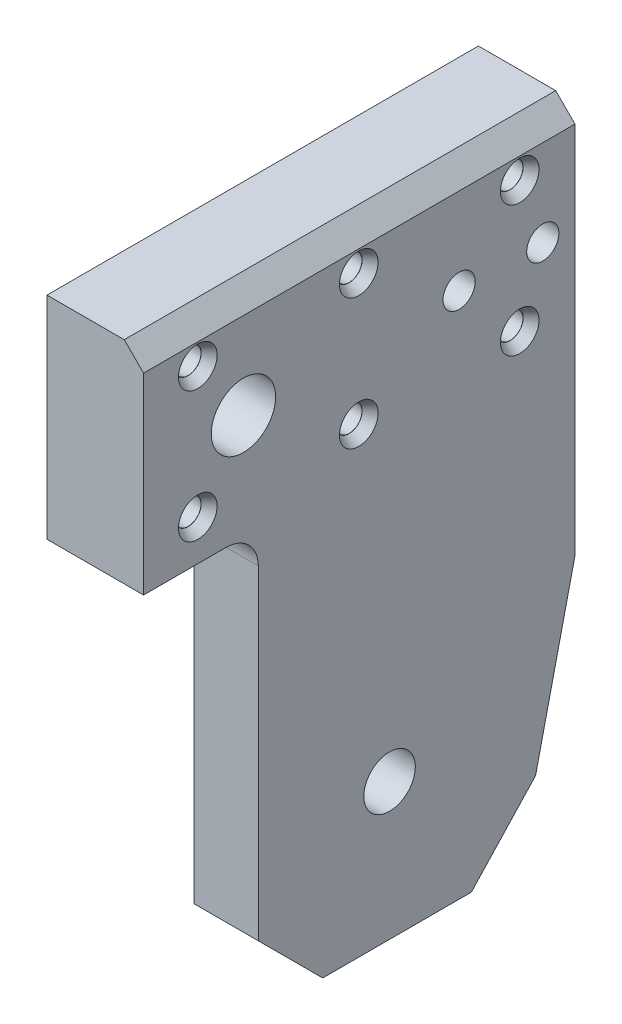
ISO-10303-21;
HEADER;
FILE_DESCRIPTION(('STEP AP214'),'2;1');
FILE_NAME('part.step','',(''),(''),'','','');
FILE_SCHEMA(('AUTOMOTIVE_DESIGN { 1 0 10303 214 1 1 1 1 }'));
ENDSEC;
DATA;
#1=APPLICATION_CONTEXT('core data for automotive mechanical design processes');
#2=APPLICATION_PROTOCOL_DEFINITION('international standard','automotive_design',2000,#1);
#3=PRODUCT_CONTEXT('',#1,'mechanical');
#4=PRODUCT('Part','Part','',(#3));
#5=PRODUCT_RELATED_PRODUCT_CATEGORY('part','',(#4));
#6=PRODUCT_DEFINITION_FORMATION('','',#4);
#7=PRODUCT_DEFINITION_CONTEXT('part definition',#1,'design');
#8=PRODUCT_DEFINITION('design','',#6,#7);
#9=PRODUCT_DEFINITION_SHAPE('','',#8);
#10=(LENGTH_UNIT() NAMED_UNIT(*) SI_UNIT(.MILLI.,.METRE.));
#11=(NAMED_UNIT(*) PLANE_ANGLE_UNIT() SI_UNIT($,.RADIAN.));
#12=(NAMED_UNIT(*) SI_UNIT($,.STERADIAN.) SOLID_ANGLE_UNIT());
#13=UNCERTAINTY_MEASURE_WITH_UNIT(LENGTH_MEASURE(1.E-05),#10,'distance_accuracy_value','');
#14=(GEOMETRIC_REPRESENTATION_CONTEXT(3) GLOBAL_UNCERTAINTY_ASSIGNED_CONTEXT((#13)) GLOBAL_UNIT_ASSIGNED_CONTEXT((#10,
#11,#12)) REPRESENTATION_CONTEXT('',''));
#15=CARTESIAN_POINT('',(0.,0.,0.));
#16=DIRECTION('',(0.,0.,1.));
#17=DIRECTION('',(1.,0.,0.));
#18=AXIS2_PLACEMENT_3D('',#15,#16,#17);
#19=CARTESIAN_POINT('',(0.,-26.5698238033902,-33.8358883973132));
#20=DIRECTION('',(1.,0.,0.));
#21=DIRECTION('',(0.,0.,-1.));
#22=AXIS2_PLACEMENT_3D('',#19,#20,#21);
#23=CYLINDRICAL_SURFACE('',#22,2.);
#24=CARTESIAN_POINT('',(0.,-26.5698238033902,-33.8358883973132));
#25=DIRECTION('',(1.,0.,0.));
#26=DIRECTION('',(0.,0.,-1.));
#27=AXIS2_PLACEMENT_3D('',#24,#25,#26);
#28=CIRCLE('',#27,2.);
#29=CARTESIAN_POINT('',(0.,-26.5698238033902,-35.8358883973132));
#30=VERTEX_POINT('',#29);
#31=EDGE_CURVE('E207',#30,#30,#28,.T.);
#32=ORIENTED_EDGE('',*,*,#31,.F.);
#33=EDGE_LOOP('',(#32));
#34=FACE_BOUND('',#33,.T.);
#35=CARTESIAN_POINT('',(13.5,-26.5698238033902,-33.8358883973132));
#36=DIRECTION('',(1.,0.,0.));
#37=DIRECTION('',(0.,0.,-1.));
#38=AXIS2_PLACEMENT_3D('',#35,#36,#37);
#39=CIRCLE('',#38,2.);
#40=CARTESIAN_POINT('',(13.5,-26.5698238033902,-35.8358883973132));
#41=VERTEX_POINT('',#40);
#42=EDGE_CURVE('E229',#41,#41,#39,.F.);
#43=ORIENTED_EDGE('',*,*,#42,.F.);
#44=EDGE_LOOP('',(#43));
#45=FACE_BOUND('',#44,.T.);
#46=ADVANCED_FACE('F31',(#34,#45),#23,.F.);
#47=CARTESIAN_POINT('',(0.,-26.5698238129198,-8.83588839731317));
#48=DIRECTION('',(1.,0.,0.));
#49=DIRECTION('',(0.,0.,-1.));
#50=AXIS2_PLACEMENT_3D('',#47,#48,#49);
#51=CYLINDRICAL_SURFACE('',#50,2.);
#52=CARTESIAN_POINT('',(0.,-26.5698238129198,-8.83588839731317));
#53=DIRECTION('',(1.,0.,0.));
#54=DIRECTION('',(0.,0.,-1.));
#55=AXIS2_PLACEMENT_3D('',#52,#53,#54);
#56=CIRCLE('',#55,2.);
#57=CARTESIAN_POINT('',(0.,-26.5698238129198,-10.8358883973132));
#58=VERTEX_POINT('',#57);
#59=EDGE_CURVE('E461',#58,#58,#56,.T.);
#60=ORIENTED_EDGE('',*,*,#59,.F.);
#61=EDGE_LOOP('',(#60));
#62=FACE_BOUND('',#61,.T.);
#63=CARTESIAN_POINT('',(13.5,-26.5698238129198,-8.83588839731317));
#64=DIRECTION('',(1.,0.,0.));
#65=DIRECTION('',(0.,0.,-1.));
#66=AXIS2_PLACEMENT_3D('',#63,#64,#65);
#67=CIRCLE('',#66,2.);
#68=CARTESIAN_POINT('',(13.5,-26.5698238129198,-10.8358883973132));
#69=VERTEX_POINT('',#68);
#70=EDGE_CURVE('E224',#69,#69,#67,.F.);
#71=ORIENTED_EDGE('',*,*,#70,.F.);
#72=EDGE_LOOP('',(#71));
#73=FACE_BOUND('',#72,.T.);
#74=ADVANCED_FACE('F306',(#62,#73),#51,.F.);
#75=CARTESIAN_POINT('',(0.,-26.5698238224494,16.1641116026868));
#76=DIRECTION('',(1.,0.,0.));
#77=DIRECTION('',(0.,0.,-1.));
#78=AXIS2_PLACEMENT_3D('',#75,#76,#77);
#79=CYLINDRICAL_SURFACE('',#78,2.);
#80=CARTESIAN_POINT('',(0.,-26.5698238224494,16.1641116026868));
#81=DIRECTION('',(1.,0.,0.));
#82=DIRECTION('',(0.,0.,-1.));
#83=AXIS2_PLACEMENT_3D('',#80,#81,#82);
#84=CIRCLE('',#83,2.);
#85=CARTESIAN_POINT('',(0.,-26.5698238224494,14.1641116026868));
#86=VERTEX_POINT('',#85);
#87=EDGE_CURVE('E464',#86,#86,#84,.T.);
#88=ORIENTED_EDGE('',*,*,#87,.F.);
#89=EDGE_LOOP('',(#88));
#90=FACE_BOUND('',#89,.T.);
#91=CARTESIAN_POINT('',(13.5,-26.5698238224494,16.1641116026868));
#92=DIRECTION('',(1.,0.,0.));
#93=DIRECTION('',(0.,0.,-1.));
#94=AXIS2_PLACEMENT_3D('',#91,#92,#93);
#95=CIRCLE('',#94,2.);
#96=CARTESIAN_POINT('',(13.5,-26.5698238224494,14.1641116026868));
#97=VERTEX_POINT('',#96);
#98=EDGE_CURVE('E219',#97,#97,#95,.F.);
#99=ORIENTED_EDGE('',*,*,#98,.F.);
#100=EDGE_LOOP('',(#99));
#101=FACE_BOUND('',#100,.T.);
#102=ADVANCED_FACE('F312',(#90,#101),#79,.F.);
#103=CARTESIAN_POINT('',(0.,-6.27649809513879,-33.8358883895777));
#104=DIRECTION('',(1.,0.,0.));
#105=DIRECTION('',(0.,0.,-1.));
#106=AXIS2_PLACEMENT_3D('',#103,#104,#105);
#107=CYLINDRICAL_SURFACE('',#106,2.);
#108=CARTESIAN_POINT('',(0.,-6.27649809513879,-33.8358883895777));
#109=DIRECTION('',(1.,0.,0.));
#110=DIRECTION('',(0.,0.,-1.));
#111=AXIS2_PLACEMENT_3D('',#108,#109,#110);
#112=CIRCLE('',#111,2.);
#113=CARTESIAN_POINT('',(0.,-6.27649809513879,-35.8358883895777));
#114=VERTEX_POINT('',#113);
#115=EDGE_CURVE('E467',#114,#114,#112,.T.);
#116=ORIENTED_EDGE('',*,*,#115,.F.);
#117=EDGE_LOOP('',(#116));
#118=FACE_BOUND('',#117,.T.);
#119=CARTESIAN_POINT('',(13.5,-6.27649809513879,-33.8358883895777));
#120=DIRECTION('',(1.,0.,0.));
#121=DIRECTION('',(0.,0.,-1.));
#122=AXIS2_PLACEMENT_3D('',#119,#120,#121);
#123=CIRCLE('',#122,2.);
#124=CARTESIAN_POINT('',(13.5,-6.27649809513879,-35.8358883895777));
#125=VERTEX_POINT('',#124);
#126=EDGE_CURVE('E214',#125,#125,#123,.F.);
#127=ORIENTED_EDGE('',*,*,#126,.F.);
#128=EDGE_LOOP('',(#127));
#129=FACE_BOUND('',#128,.T.);
#130=ADVANCED_FACE('F323',(#118,#129),#107,.F.);
#131=CARTESIAN_POINT('',(0.,-6.27649810466838,-8.83588838957769));
#132=DIRECTION('',(1.,0.,0.));
#133=DIRECTION('',(0.,0.,-1.));
#134=AXIS2_PLACEMENT_3D('',#131,#132,#133);
#135=CYLINDRICAL_SURFACE('',#134,2.);
#136=CARTESIAN_POINT('',(0.,-6.27649810466838,-8.83588838957769));
#137=DIRECTION('',(1.,0.,0.));
#138=DIRECTION('',(0.,0.,-1.));
#139=AXIS2_PLACEMENT_3D('',#136,#137,#138);
#140=CIRCLE('',#139,2.);
#141=CARTESIAN_POINT('',(0.,-6.27649810466838,-10.8358883895777));
#142=VERTEX_POINT('',#141);
#143=EDGE_CURVE('E470',#142,#142,#140,.T.);
#144=ORIENTED_EDGE('',*,*,#143,.F.);
#145=EDGE_LOOP('',(#144));
#146=FACE_BOUND('',#145,.T.);
#147=CARTESIAN_POINT('',(13.5,-6.27649810466838,-8.83588838957769));
#148=DIRECTION('',(1.,0.,0.));
#149=DIRECTION('',(0.,0.,-1.));
#150=AXIS2_PLACEMENT_3D('',#147,#148,#149);
#151=CIRCLE('',#150,2.);
#152=CARTESIAN_POINT('',(13.5,-6.27649810466838,-10.8358883895777));
#153=VERTEX_POINT('',#152);
#154=EDGE_CURVE('E209',#153,#153,#151,.F.);
#155=ORIENTED_EDGE('',*,*,#154,.F.);
#156=EDGE_LOOP('',(#155));
#157=FACE_BOUND('',#156,.T.);
#158=ADVANCED_FACE('F327',(#146,#157),#135,.F.);
#159=CARTESIAN_POINT('',(0.,-6.27649811419797,16.1641116104223));
#160=DIRECTION('',(1.,0.,0.));
#161=DIRECTION('',(0.,0.,-1.));
#162=AXIS2_PLACEMENT_3D('',#159,#160,#161);
#163=CYLINDRICAL_SURFACE('',#162,2.);
#164=CARTESIAN_POINT('',(0.,-6.27649811419797,16.1641116104223));
#165=DIRECTION('',(1.,0.,0.));
#166=DIRECTION('',(0.,0.,-1.));
#167=AXIS2_PLACEMENT_3D('',#164,#165,#166);
#168=CIRCLE('',#167,2.);
#169=CARTESIAN_POINT('',(0.,-6.27649811419797,14.1641116104223));
#170=VERTEX_POINT('',#169);
#171=EDGE_CURVE('E473',#170,#170,#168,.T.);
#172=ORIENTED_EDGE('',*,*,#171,.F.);
#173=EDGE_LOOP('',(#172));
#174=FACE_BOUND('',#173,.T.);
#175=CARTESIAN_POINT('',(13.5,-6.27649811419797,16.1641116104223));
#176=DIRECTION('',(1.,0.,0.));
#177=DIRECTION('',(0.,0.,-1.));
#178=AXIS2_PLACEMENT_3D('',#175,#176,#177);
#179=CIRCLE('',#178,2.);
#180=CARTESIAN_POINT('',(13.5,-6.27649811419797,14.1641116104223));
#181=VERTEX_POINT('',#180);
#182=EDGE_CURVE('E204',#181,#181,#179,.F.);
#183=ORIENTED_EDGE('',*,*,#182,.F.);
#184=EDGE_LOOP('',(#183));
#185=FACE_BOUND('',#184,.T.);
#186=ADVANCED_FACE('F331',(#174,#185),#163,.F.);
#187=CARTESIAN_POINT('',(15.,-0.00061706357254096,-42.4174534241833));
#188=DIRECTION('',(-1.,0.,0.));
#189=DIRECTION('',(0.,0.,1.));
#190=AXIS2_PLACEMENT_3D('',#187,#188,#189);
#191=PLANE('',#190);
#192=CARTESIAN_POINT('',(15.,-26.5698238033902,-33.8358883973132));
#193=DIRECTION('',(1.,0.,0.));
#194=DIRECTION('',(0.,0.,-1.));
#195=AXIS2_PLACEMENT_3D('',#192,#193,#194);
#196=CIRCLE('',#195,3.);
#197=CARTESIAN_POINT('',(15.,-26.5698238033902,-36.8358883973132));
#198=VERTEX_POINT('',#197);
#199=EDGE_CURVE('E435',#198,#198,#196,.T.);
#200=ORIENTED_EDGE('',*,*,#199,.F.);
#201=EDGE_LOOP('',(#200));
#202=FACE_BOUND('',#201,.T.);
#203=CARTESIAN_POINT('',(15.,-26.5698238129198,-8.83588839731317));
#204=DIRECTION('',(1.,0.,0.));
#205=DIRECTION('',(0.,0.,-1.));
#206=AXIS2_PLACEMENT_3D('',#203,#204,#205);
#207=CIRCLE('',#206,3.);
#208=CARTESIAN_POINT('',(15.,-26.5698238129198,-11.8358883973132));
#209=VERTEX_POINT('',#208);
#210=EDGE_CURVE('E232',#209,#209,#207,.T.);
#211=ORIENTED_EDGE('',*,*,#210,.F.);
#212=EDGE_LOOP('',(#211));
#213=FACE_BOUND('',#212,.T.);
#214=CARTESIAN_POINT('',(15.,-26.5698238224494,16.1641116026868));
#215=DIRECTION('',(1.,0.,0.));
#216=DIRECTION('',(0.,0.,-1.));
#217=AXIS2_PLACEMENT_3D('',#214,#215,#216);
#218=CIRCLE('',#217,3.);
#219=CARTESIAN_POINT('',(15.,-26.5698238224494,13.1641116026868));
#220=VERTEX_POINT('',#219);
#221=EDGE_CURVE('E227',#220,#220,#218,.T.);
#222=ORIENTED_EDGE('',*,*,#221,.F.);
#223=EDGE_LOOP('',(#222));
#224=FACE_BOUND('',#223,.T.);
#225=CARTESIAN_POINT('',(15.,-6.27649809513879,-33.8358883895777));
#226=DIRECTION('',(1.,0.,0.));
#227=DIRECTION('',(0.,0.,-1.));
#228=AXIS2_PLACEMENT_3D('',#225,#226,#227);
#229=CIRCLE('',#228,3.);
#230=CARTESIAN_POINT('',(15.,-6.27649809513879,-36.8358883895777));
#231=VERTEX_POINT('',#230);
#232=EDGE_CURVE('E222',#231,#231,#229,.T.);
#233=ORIENTED_EDGE('',*,*,#232,.F.);
#234=EDGE_LOOP('',(#233));
#235=FACE_BOUND('',#234,.T.);
#236=CARTESIAN_POINT('',(15.,-6.27649810466838,-8.83588838957769));
#237=DIRECTION('',(1.,0.,0.));
#238=DIRECTION('',(0.,0.,-1.));
#239=AXIS2_PLACEMENT_3D('',#236,#237,#238);
#240=CIRCLE('',#239,3.);
#241=CARTESIAN_POINT('',(15.,-6.27649810466838,-11.8358883895777));
#242=VERTEX_POINT('',#241);
#243=EDGE_CURVE('E217',#242,#242,#240,.T.);
#244=ORIENTED_EDGE('',*,*,#243,.F.);
#245=EDGE_LOOP('',(#244));
#246=FACE_BOUND('',#245,.T.);
#247=CARTESIAN_POINT('',(15.,-6.27649811419797,16.1641116104223));
#248=DIRECTION('',(1.,0.,0.));
#249=DIRECTION('',(0.,0.,-1.));
#250=AXIS2_PLACEMENT_3D('',#247,#248,#249);
#251=CIRCLE('',#250,3.);
#252=CARTESIAN_POINT('',(15.,-6.27649811419797,13.1641116104223));
#253=VERTEX_POINT('',#252);
#254=EDGE_CURVE('E212',#253,#253,#251,.T.);
#255=ORIENTED_EDGE('',*,*,#254,.F.);
#256=EDGE_LOOP('',(#255));
#257=FACE_BOUND('',#256,.T.);
#258=CARTESIAN_POINT('',(15.,-16.4231609478993,-37.4174534476372));
#259=DIRECTION('',(1.,0.,0.));
#260=DIRECTION('',(0.,0.,-1.));
#261=AXIS2_PLACEMENT_3D('',#258,#259,#260);
#262=CIRCLE('',#261,2.49999999999999);
#263=CARTESIAN_POINT('',(15.,-16.4231609478993,-39.9174534476372));
#264=VERTEX_POINT('',#263);
#265=EDGE_CURVE('E476',#264,#264,#262,.T.);
#266=ORIENTED_EDGE('',*,*,#265,.F.);
#267=EDGE_LOOP('',(#266));
#268=FACE_BOUND('',#267,.T.);
#269=CARTESIAN_POINT('',(15.,-16.4231609528546,-24.4174534476372));
#270=DIRECTION('',(1.,0.,0.));
#271=DIRECTION('',(0.,0.,-1.));
#272=AXIS2_PLACEMENT_3D('',#269,#270,#271);
#273=CIRCLE('',#272,2.5);
#274=CARTESIAN_POINT('',(15.,-16.4231609528546,-26.9174534476372));
#275=VERTEX_POINT('',#274);
#276=EDGE_CURVE('E480',#275,#275,#273,.T.);
#277=ORIENTED_EDGE('',*,*,#276,.F.);
#278=EDGE_LOOP('',(#277));
#279=FACE_BOUND('',#278,.T.);
#280=CARTESIAN_POINT('',(15.,-16.4231609502295,9.0688019919351));
#281=DIRECTION('',(1.,0.,0.));
#282=DIRECTION('',(0.,0.,-1.));
#283=AXIS2_PLACEMENT_3D('',#280,#281,#282);
#284=CIRCLE('',#283,5.00000000000021);
#285=CARTESIAN_POINT('',(15.,-16.4231609502295,4.06880199193489));
#286=VERTEX_POINT('',#285);
#287=EDGE_CURVE('E486',#286,#286,#284,.T.);
#288=ORIENTED_EDGE('',*,*,#287,.F.);
#289=EDGE_LOOP('',(#288));
#290=FACE_BOUND('',#289,.T.);
#291=DIRECTION('',(0.,1.,0.));
#292=VECTOR('',#291,1.);
#293=CARTESIAN_POINT('',(15.,-0.00061706357254096,-42.4174534241833));
#294=LINE('',#293,#292);
#295=CARTESIAN_POINT('',(15.,-61.0273478765875,-42.4174534241833));
#296=VERTEX_POINT('',#295);
#297=CARTESIAN_POINT('',(15.,-3.00061706357254,-42.4174534241833));
#298=VERTEX_POINT('',#297);
#299=EDGE_CURVE('E165',#296,#298,#294,.T.);
#300=ORIENTED_EDGE('',*,*,#299,.T.);
#301=DIRECTION('',(0.,0.,1.));
#302=VECTOR('',#301,1.);
#303=CARTESIAN_POINT('',(15.,-3.00061706357254,-42.4174534241833));
#304=LINE('',#303,#302);
#305=CARTESIAN_POINT('',(15.,-3.00061706357254,24.5825465758172));
#306=VERTEX_POINT('',#305);
#307=EDGE_CURVE('E203',#298,#306,#304,.T.);
#308=ORIENTED_EDGE('',*,*,#307,.T.);
#309=DIRECTION('',(0.,-1.,0.));
#310=VECTOR('',#309,1.);
#311=CARTESIAN_POINT('',(15.,-0.00061706357254096,24.5825465758172));
#312=LINE('',#311,#310);
#313=CARTESIAN_POINT('',(15.,-32.8457048322162,24.5825465758172));
#314=VERTEX_POINT('',#313);
#315=EDGE_CURVE('E153',#306,#314,#312,.T.);
#316=ORIENTED_EDGE('',*,*,#315,.T.);
#317=DIRECTION('',(0.,0.,-1.));
#318=VECTOR('',#317,1.);
#319=CARTESIAN_POINT('',(15.,-32.8457048322162,24.5825465758172));
#320=LINE('',#319,#318);
#321=CARTESIAN_POINT('',(15.,-32.8457048322162,11.7662828103427));
#322=VERTEX_POINT('',#321);
#323=EDGE_CURVE('E156',#314,#322,#320,.T.);
#324=ORIENTED_EDGE('',*,*,#323,.T.);
#325=CARTESIAN_POINT('',(15.,-37.8457048322162,11.7662828103427));
#326=DIRECTION('',(-1.,0.,0.));
#327=DIRECTION('',(0.,0.,1.));
#328=AXIS2_PLACEMENT_3D('',#325,#326,#327);
#329=CIRCLE('',#328,5.);
#330=CARTESIAN_POINT('',(15.,-37.8457048322162,6.76628281034272));
#331=VERTEX_POINT('',#330);
#332=EDGE_CURVE('E201',#322,#331,#329,.T.);
#333=ORIENTED_EDGE('',*,*,#332,.T.);
#334=DIRECTION('',(0.,-1.,0.));
#335=VECTOR('',#334,1.);
#336=CARTESIAN_POINT('',(15.,-32.8457048322162,6.76628281034273));
#337=LINE('',#336,#335);
#338=CARTESIAN_POINT('',(15.,-88.2589051017671,6.76628281034272));
#339=VERTEX_POINT('',#338);
#340=EDGE_CURVE('E255',#331,#339,#337,.T.);
#341=ORIENTED_EDGE('',*,*,#340,.T.);
#342=DIRECTION('',(0.,0.707106781186549,0.707106781186546));
#343=VECTOR('',#342,1.);
#344=CARTESIAN_POINT('',(15.,-98.2589051017671,-3.23371718965728));
#345=LINE('',#344,#343);
#346=CARTESIAN_POINT('',(15.,-98.2589051017671,-3.23371718965728));
#347=VERTEX_POINT('',#346);
#348=EDGE_CURVE('E183',#339,#347,#345,.F.);
#349=ORIENTED_EDGE('',*,*,#348,.T.);
#350=DIRECTION('',(0.,0.,-1.));
#351=VECTOR('',#350,1.);
#352=CARTESIAN_POINT('',(15.,-98.2589051017671,6.76628281034272));
#353=LINE('',#352,#351);
#354=CARTESIAN_POINT('',(15.,-98.2589051017671,-26.3276399787837));
#355=VERTEX_POINT('',#354);
#356=EDGE_CURVE('E257',#347,#355,#353,.T.);
#357=ORIENTED_EDGE('',*,*,#356,.T.);
#358=DIRECTION('',(0.,-0.731353701619169,0.6819983600625));
#359=VECTOR('',#358,1.);
#360=CARTESIAN_POINT('',(15.,-87.5721277551641,-36.2932210766853));
#361=LINE('',#360,#359);
#362=CARTESIAN_POINT('',(15.,-87.5721277551641,-36.2932210766853));
#363=VERTEX_POINT('',#362);
#364=EDGE_CURVE('E192',#355,#363,#361,.F.);
#365=ORIENTED_EDGE('',*,*,#364,.T.);
#366=DIRECTION('',(0.,0.974403146525024,-0.224807713484508));
#367=VECTOR('',#366,1.);
#368=CARTESIAN_POINT('',(15.,-98.2589051017671,-33.8276399787838));
#369=LINE('',#368,#367);
#370=EDGE_CURVE('E263',#363,#296,#369,.T.);
#371=ORIENTED_EDGE('',*,*,#370,.T.);
#372=EDGE_LOOP('',(#300,#308,#316,#324,#333,#341,#349,#357,#365,#371));
#373=FACE_BOUND('',#372,.T.);
#374=CARTESIAN_POINT('',(15.,-77.0296865911719,-13.6201329130667));
#375=DIRECTION('',(1.,0.,0.));
#376=DIRECTION('',(0.,0.,-1.));
#377=AXIS2_PLACEMENT_3D('',#374,#375,#376);
#378=CIRCLE('',#377,4.00000000000001);
#379=CARTESIAN_POINT('',(15.,-77.0296865911719,-17.6201329130667));
#380=VERTEX_POINT('',#379);
#381=EDGE_CURVE('E267',#380,#380,#378,.T.);
#382=ORIENTED_EDGE('',*,*,#381,.F.);
#383=EDGE_LOOP('',(#382));
#384=FACE_BOUND('',#383,.T.);
#385=ADVANCED_FACE('F239',(#202,#213,#224,#235,#246,#257,#268,#279,#290,#373,#384),#191,.F.);
#386=CARTESIAN_POINT('',(0.,-0.00061706357254096,-42.4174534241833));
#387=DIRECTION('',(-1.,0.,0.));
#388=DIRECTION('',(0.,0.,1.));
#389=AXIS2_PLACEMENT_3D('',#386,#387,#388);
#390=PLANE('',#389);
#391=ORIENTED_EDGE('',*,*,#31,.T.);
#392=EDGE_LOOP('',(#391));
#393=FACE_BOUND('',#392,.T.);
#394=ORIENTED_EDGE('',*,*,#59,.T.);
#395=EDGE_LOOP('',(#394));
#396=FACE_BOUND('',#395,.T.);
#397=ORIENTED_EDGE('',*,*,#87,.T.);
#398=EDGE_LOOP('',(#397));
#399=FACE_BOUND('',#398,.T.);
#400=ORIENTED_EDGE('',*,*,#115,.T.);
#401=EDGE_LOOP('',(#400));
#402=FACE_BOUND('',#401,.T.);
#403=ORIENTED_EDGE('',*,*,#143,.T.);
#404=EDGE_LOOP('',(#403));
#405=FACE_BOUND('',#404,.T.);
#406=ORIENTED_EDGE('',*,*,#171,.T.);
#407=EDGE_LOOP('',(#406));
#408=FACE_BOUND('',#407,.T.);
#409=CARTESIAN_POINT('',(0.,-16.4231609478993,-37.4174534476372));
#410=DIRECTION('',(1.,0.,0.));
#411=DIRECTION('',(0.,0.,-1.));
#412=AXIS2_PLACEMENT_3D('',#409,#410,#411);
#413=CIRCLE('',#412,2.49999999999999);
#414=CARTESIAN_POINT('',(0.,-16.4231609478993,-39.9174534476372));
#415=VERTEX_POINT('',#414);
#416=EDGE_CURVE('E477',#415,#415,#413,.T.);
#417=ORIENTED_EDGE('',*,*,#416,.T.);
#418=EDGE_LOOP('',(#417));
#419=FACE_BOUND('',#418,.T.);
#420=CARTESIAN_POINT('',(0.,-16.4231609528546,-24.4174534476372));
#421=DIRECTION('',(1.,0.,0.));
#422=DIRECTION('',(0.,0.,-1.));
#423=AXIS2_PLACEMENT_3D('',#420,#421,#422);
#424=CIRCLE('',#423,2.5);
#425=CARTESIAN_POINT('',(0.,-16.4231609528546,-26.9174534476372));
#426=VERTEX_POINT('',#425);
#427=EDGE_CURVE('E483',#426,#426,#424,.T.);
#428=ORIENTED_EDGE('',*,*,#427,.T.);
#429=EDGE_LOOP('',(#428));
#430=FACE_BOUND('',#429,.T.);
#431=CARTESIAN_POINT('',(0.,-16.4231609502295,9.0688019919351));
#432=DIRECTION('',(1.,0.,0.));
#433=DIRECTION('',(0.,0.,-1.));
#434=AXIS2_PLACEMENT_3D('',#431,#432,#433);
#435=CIRCLE('',#434,5.00000000000021);
#436=CARTESIAN_POINT('',(0.,-16.4231609502295,4.06880199193489));
#437=VERTEX_POINT('',#436);
#438=EDGE_CURVE('E136',#437,#437,#435,.T.);
#439=ORIENTED_EDGE('',*,*,#438,.T.);
#440=EDGE_LOOP('',(#439));
#441=FACE_BOUND('',#440,.T.);
#442=DIRECTION('',(0.,0.,-1.));
#443=VECTOR('',#442,1.);
#444=CARTESIAN_POINT('',(0.,-40.202173661987,-42.4174534241833));
#445=LINE('',#444,#443);
#446=CARTESIAN_POINT('',(0.,-40.202173661987,6.76628281034272));
#447=VERTEX_POINT('',#446);
#448=CARTESIAN_POINT('',(0.,-40.202173661987,-42.4174534241833));
#449=VERTEX_POINT('',#448);
#450=EDGE_CURVE('E124',#447,#449,#445,.T.);
#451=ORIENTED_EDGE('',*,*,#450,.F.);
#452=DIRECTION('',(0.,-1.,0.));
#453=VECTOR('',#452,1.);
#454=CARTESIAN_POINT('',(0.,-32.8457048322162,6.76628281034273));
#455=LINE('',#454,#453);
#456=CARTESIAN_POINT('',(0.,-37.8457048322162,6.76628281034272));
#457=VERTEX_POINT('',#456);
#458=EDGE_CURVE('E154',#457,#447,#455,.T.);
#459=ORIENTED_EDGE('',*,*,#458,.F.);
#460=CARTESIAN_POINT('',(0.,-37.8457048322162,11.7662828103427));
#461=DIRECTION('',(-1.,0.,0.));
#462=DIRECTION('',(0.,0.,1.));
#463=AXIS2_PLACEMENT_3D('',#460,#461,#462);
#464=CIRCLE('',#463,5.);
#465=CARTESIAN_POINT('',(0.,-32.8457048322162,11.7662828103427));
#466=VERTEX_POINT('',#465);
#467=EDGE_CURVE('E199',#457,#466,#464,.F.);
#468=ORIENTED_EDGE('',*,*,#467,.T.);
#469=DIRECTION('',(0.,0.,-1.));
#470=VECTOR('',#469,1.);
#471=CARTESIAN_POINT('',(0.,-32.8457048322162,24.5825465758172));
#472=LINE('',#471,#470);
#473=CARTESIAN_POINT('',(0.,-32.8457048322162,24.5825465758172));
#474=VERTEX_POINT('',#473);
#475=EDGE_CURVE('E158',#474,#466,#472,.T.);
#476=ORIENTED_EDGE('',*,*,#475,.F.);
#477=DIRECTION('',(0.,-1.,0.));
#478=VECTOR('',#477,1.);
#479=CARTESIAN_POINT('',(0.,-0.00061706357254096,24.5825465758172));
#480=LINE('',#479,#478);
#481=CARTESIAN_POINT('',(0.,-0.00061706357254096,24.5825465758172));
#482=VERTEX_POINT('',#481);
#483=EDGE_CURVE('E248',#482,#474,#480,.T.);
#484=ORIENTED_EDGE('',*,*,#483,.F.);
#485=DIRECTION('',(0.,0.,1.));
#486=VECTOR('',#485,1.);
#487=CARTESIAN_POINT('',(0.,-0.00061706357254096,24.5825465758172));
#488=LINE('',#487,#486);
#489=CARTESIAN_POINT('',(0.,-0.00061706357254096,-42.4174534241833));
#490=VERTEX_POINT('',#489);
#491=EDGE_CURVE('E152',#490,#482,#488,.T.);
#492=ORIENTED_EDGE('',*,*,#491,.F.);
#493=DIRECTION('',(0.,1.,0.));
#494=VECTOR('',#493,1.);
#495=CARTESIAN_POINT('',(0.,-0.00061706357254096,-42.4174534241833));
#496=LINE('',#495,#494);
#497=EDGE_CURVE('E142',#449,#490,#496,.T.);
#498=ORIENTED_EDGE('',*,*,#497,.F.);
#499=EDGE_LOOP('',(#451,#459,#468,#476,#484,#492,#498));
#500=FACE_BOUND('',#499,.T.);
#501=ADVANCED_FACE('F149',(#393,#396,#399,#402,#405,#408,#419,#430,#441,#500),#390,.T.);
#502=CARTESIAN_POINT('',(15.,-0.00061706357254096,24.5825465758172));
#503=DIRECTION('',(0.,-1.,0.));
#504=DIRECTION('',(0.,0.,-1.));
#505=AXIS2_PLACEMENT_3D('',#502,#503,#504);
#506=PLANE('',#505);
#507=DIRECTION('',(-1.,0.,0.));
#508=VECTOR('',#507,1.);
#509=CARTESIAN_POINT('',(15.,-0.00061706357254096,24.5825465758172));
#510=LINE('',#509,#508);
#511=CARTESIAN_POINT('',(12.,-0.00061706357254096,24.5825465758172));
#512=VERTEX_POINT('',#511);
#513=EDGE_CURVE('E170',#512,#482,#510,.T.);
#514=ORIENTED_EDGE('',*,*,#513,.F.);
#515=DIRECTION('',(0.,0.,-1.));
#516=VECTOR('',#515,1.);
#517=CARTESIAN_POINT('',(12.,-0.00061706357254096,24.5825465758172));
#518=LINE('',#517,#516);
#519=CARTESIAN_POINT('',(12.,-0.000617063572541177,-42.4174534241833));
#520=VERTEX_POINT('',#519);
#521=EDGE_CURVE('E39',#512,#520,#518,.T.);
#522=ORIENTED_EDGE('',*,*,#521,.T.);
#523=DIRECTION('',(-1.,0.,0.));
#524=VECTOR('',#523,1.);
#525=CARTESIAN_POINT('',(15.,-0.00061706357254096,-42.4174534241833));
#526=LINE('',#525,#524);
#527=EDGE_CURVE('E162',#520,#490,#526,.T.);
#528=ORIENTED_EDGE('',*,*,#527,.T.);
#529=ORIENTED_EDGE('',*,*,#491,.T.);
#530=EDGE_LOOP('',(#514,#522,#528,#529));
#531=FACE_BOUND('',#530,.T.);
#532=ADVANCED_FACE('F363',(#531),#506,.F.);
#533=CARTESIAN_POINT('',(15.,-0.00061706357254096,24.5825465758172));
#534=DIRECTION('',(0.,0.,-1.));
#535=DIRECTION('',(-1.,0.,0.));
#536=AXIS2_PLACEMENT_3D('',#533,#534,#535);
#537=PLANE('',#536);
#538=ORIENTED_EDGE('',*,*,#315,.F.);
#539=DIRECTION('',(0.707106781186549,-0.707106781186546,0.));
#540=VECTOR('',#539,1.);
#541=CARTESIAN_POINT('',(15.,-3.00061706357254,24.5825465758172));
#542=LINE('',#541,#540);
#543=EDGE_CURVE('E53',#306,#512,#542,.F.);
#544=ORIENTED_EDGE('',*,*,#543,.T.);
#545=ORIENTED_EDGE('',*,*,#513,.T.);
#546=ORIENTED_EDGE('',*,*,#483,.T.);
#547=DIRECTION('',(-1.,0.,0.));
#548=VECTOR('',#547,1.);
#549=CARTESIAN_POINT('',(15.,-32.8457048322162,24.5825465758172));
#550=LINE('',#549,#548);
#551=EDGE_CURVE('E167',#314,#474,#550,.T.);
#552=ORIENTED_EDGE('',*,*,#551,.F.);
#553=EDGE_LOOP('',(#538,#544,#545,#546,#552));
#554=FACE_BOUND('',#553,.T.);
#555=ADVANCED_FACE('F246',(#554),#537,.F.);
#556=CARTESIAN_POINT('',(15.,-32.8457048322162,24.5825465758172));
#557=DIRECTION('',(0.,1.,0.));
#558=DIRECTION('',(0.,0.,1.));
#559=AXIS2_PLACEMENT_3D('',#556,#557,#558);
#560=PLANE('',#559);
#561=ORIENTED_EDGE('',*,*,#475,.T.);
#562=DIRECTION('',(-1.,0.,0.));
#563=VECTOR('',#562,1.);
#564=CARTESIAN_POINT('',(15.,-32.8457048322162,11.7662828103427));
#565=LINE('',#564,#563);
#566=EDGE_CURVE('E197',#466,#322,#565,.F.);
#567=ORIENTED_EDGE('',*,*,#566,.T.);
#568=ORIENTED_EDGE('',*,*,#323,.F.);
#569=ORIENTED_EDGE('',*,*,#551,.T.);
#570=EDGE_LOOP('',(#561,#567,#568,#569));
#571=FACE_BOUND('',#570,.T.);
#572=ADVANCED_FACE('F252',(#571),#560,.F.);
#573=CARTESIAN_POINT('',(15.,-32.8457048322162,6.76628281034273));
#574=DIRECTION('',(0.,0.,-1.));
#575=DIRECTION('',(0.,1.,0.));
#576=AXIS2_PLACEMENT_3D('',#573,#574,#575);
#577=PLANE('',#576);
#578=ORIENTED_EDGE('',*,*,#340,.F.);
#579=DIRECTION('',(-1.,0.,0.));
#580=VECTOR('',#579,1.);
#581=CARTESIAN_POINT('',(0.,-37.8457048322162,6.76628281034272));
#582=LINE('',#581,#580);
#583=EDGE_CURVE('E194',#331,#457,#582,.T.);
#584=ORIENTED_EDGE('',*,*,#583,.T.);
#585=ORIENTED_EDGE('',*,*,#458,.T.);
#586=DIRECTION('',(1.,0.,0.));
#587=VECTOR('',#586,1.);
#588=CARTESIAN_POINT('',(15.,-40.202173661987,6.76628281034272));
#589=LINE('',#588,#587);
#590=CARTESIAN_POINT('',(5.,-40.202173661987,6.76628281034272));
#591=VERTEX_POINT('',#590);
#592=EDGE_CURVE('E131',#447,#591,#589,.T.);
#593=ORIENTED_EDGE('',*,*,#592,.T.);
#594=DIRECTION('',(0.,-1.,0.));
#595=VECTOR('',#594,1.);
#596=CARTESIAN_POINT('',(5.,-32.8457048322162,6.76628281034273));
#597=LINE('',#596,#595);
#598=CARTESIAN_POINT('',(5.,-88.2589051017671,6.76628281034272));
#599=VERTEX_POINT('',#598);
#600=EDGE_CURVE('E277',#591,#599,#597,.T.);
#601=ORIENTED_EDGE('',*,*,#600,.T.);
#602=DIRECTION('',(1.,0.,0.));
#603=VECTOR('',#602,1.);
#604=CARTESIAN_POINT('',(15.,-88.2589051017671,6.76628281034272));
#605=LINE('',#604,#603);
#606=EDGE_CURVE('E180',#599,#339,#605,.T.);
#607=ORIENTED_EDGE('',*,*,#606,.T.);
#608=EDGE_LOOP('',(#578,#584,#585,#593,#601,#607));
#609=FACE_BOUND('',#608,.T.);
#610=ADVANCED_FACE('F273',(#609),#577,.F.);
#611=CARTESIAN_POINT('',(15.,-98.2589051017671,6.76628281034272));
#612=DIRECTION('',(0.,1.,0.));
#613=DIRECTION('',(0.,0.,1.));
#614=AXIS2_PLACEMENT_3D('',#611,#612,#613);
#615=PLANE('',#614);
#616=DIRECTION('',(0.,0.,-1.));
#617=VECTOR('',#616,1.);
#618=CARTESIAN_POINT('',(5.,-98.2589051017671,6.76628281034272));
#619=LINE('',#618,#617);
#620=CARTESIAN_POINT('',(5.,-98.2589051017671,-3.23371718965728));
#621=VERTEX_POINT('',#620);
#622=CARTESIAN_POINT('',(5.,-98.2589051017671,-26.3276399787837));
#623=VERTEX_POINT('',#622);
#624=EDGE_CURVE('E288',#621,#623,#619,.T.);
#625=ORIENTED_EDGE('',*,*,#624,.T.);
#626=DIRECTION('',(1.,0.,0.));
#627=VECTOR('',#626,1.);
#628=CARTESIAN_POINT('',(15.,-98.2589051017671,-26.3276399787837));
#629=LINE('',#628,#627);
#630=EDGE_CURVE('E190',#623,#355,#629,.T.);
#631=ORIENTED_EDGE('',*,*,#630,.T.);
#632=ORIENTED_EDGE('',*,*,#356,.F.);
#633=DIRECTION('',(-1.,0.,0.));
#634=VECTOR('',#633,1.);
#635=CARTESIAN_POINT('',(15.,-98.2589051017671,-3.23371718965728));
#636=LINE('',#635,#634);
#637=EDGE_CURVE('E172',#347,#621,#636,.T.);
#638=ORIENTED_EDGE('',*,*,#637,.T.);
#639=EDGE_LOOP('',(#625,#631,#632,#638));
#640=FACE_BOUND('',#639,.T.);
#641=ADVANCED_FACE('F285',(#640),#615,.F.);
#642=CARTESIAN_POINT('',(15.,-98.2589051017671,-33.8276399787838));
#643=DIRECTION('',(0.,0.224807713484508,0.974403146525024));
#644=DIRECTION('',(0.,-0.974403146525024,0.224807713484508));
#645=AXIS2_PLACEMENT_3D('',#642,#643,#644);
#646=PLANE('',#645);
#647=ORIENTED_EDGE('',*,*,#370,.F.);
#648=DIRECTION('',(-1.,0.,0.));
#649=VECTOR('',#648,1.);
#650=CARTESIAN_POINT('',(15.,-87.5721277551641,-36.2932210766853));
#651=LINE('',#650,#649);
#652=CARTESIAN_POINT('',(5.,-87.5721277551641,-36.2932210766853));
#653=VERTEX_POINT('',#652);
#654=EDGE_CURVE('E185',#363,#653,#651,.T.);
#655=ORIENTED_EDGE('',*,*,#654,.T.);
#656=DIRECTION('',(0.,0.974403146525024,-0.224807713484508));
#657=VECTOR('',#656,1.);
#658=CARTESIAN_POINT('',(5.,-98.2589051017671,-33.8276399787838));
#659=LINE('',#658,#657);
#660=CARTESIAN_POINT('',(5.,-61.0273478765875,-42.4174534241833));
#661=VERTEX_POINT('',#660);
#662=EDGE_CURVE('E175',#653,#661,#659,.T.);
#663=ORIENTED_EDGE('',*,*,#662,.T.);
#664=DIRECTION('',(-1.,0.,0.));
#665=VECTOR('',#664,1.);
#666=CARTESIAN_POINT('',(15.,-61.0273478765875,-42.4174534241833));
#667=LINE('',#666,#665);
#668=EDGE_CURVE('E164',#296,#661,#667,.T.);
#669=ORIENTED_EDGE('',*,*,#668,.F.);
#670=EDGE_LOOP('',(#647,#655,#663,#669));
#671=FACE_BOUND('',#670,.T.);
#672=ADVANCED_FACE('F295',(#671),#646,.F.);
#673=CARTESIAN_POINT('',(15.,-0.00061706357254096,-42.4174534241833));
#674=DIRECTION('',(0.,0.,1.));
#675=DIRECTION('',(1.,0.,0.));
#676=AXIS2_PLACEMENT_3D('',#673,#674,#675);
#677=PLANE('',#676);
#678=ORIENTED_EDGE('',*,*,#527,.F.);
#679=DIRECTION('',(-0.707106781186549,0.707106781186546,0.));
#680=VECTOR('',#679,1.);
#681=CARTESIAN_POINT('',(15.,-3.00061706357254,-42.4174534241833));
#682=LINE('',#681,#680);
#683=EDGE_CURVE('E11',#520,#298,#682,.F.);
#684=ORIENTED_EDGE('',*,*,#683,.T.);
#685=ORIENTED_EDGE('',*,*,#299,.F.);
#686=ORIENTED_EDGE('',*,*,#668,.T.);
#687=DIRECTION('',(0.,-1.,0.));
#688=VECTOR('',#687,1.);
#689=CARTESIAN_POINT('',(5.,-40.202173661987,-42.4174534241833));
#690=LINE('',#689,#688);
#691=CARTESIAN_POINT('',(5.,-40.202173661987,-42.4174534241833));
#692=VERTEX_POINT('',#691);
#693=EDGE_CURVE('E135',#692,#661,#690,.T.);
#694=ORIENTED_EDGE('',*,*,#693,.F.);
#695=DIRECTION('',(-1.,0.,0.));
#696=VECTOR('',#695,1.);
#697=CARTESIAN_POINT('',(5.,-40.202173661987,-42.4174534241833));
#698=LINE('',#697,#696);
#699=EDGE_CURVE('E128',#692,#449,#698,.T.);
#700=ORIENTED_EDGE('',*,*,#699,.T.);
#701=ORIENTED_EDGE('',*,*,#497,.T.);
#702=EDGE_LOOP('',(#678,#684,#685,#686,#694,#700,#701));
#703=FACE_BOUND('',#702,.T.);
#704=ADVANCED_FACE('F141',(#703),#677,.F.);
#705=CARTESIAN_POINT('',(15.,-77.0296865911719,-13.6201329130667));
#706=DIRECTION('',(-1.,0.,0.));
#707=DIRECTION('',(0.,0.,1.));
#708=AXIS2_PLACEMENT_3D('',#705,#706,#707);
#709=CYLINDRICAL_SURFACE('',#708,4.00000000000001);
#710=CARTESIAN_POINT('',(5.,-77.0296865911719,-13.6201329130667));
#711=DIRECTION('',(1.,0.,0.));
#712=DIRECTION('',(0.,0.,-1.));
#713=AXIS2_PLACEMENT_3D('',#710,#711,#712);
#714=CIRCLE('',#713,4.00000000000001);
#715=CARTESIAN_POINT('',(5.,-77.0296865911719,-17.6201329130667));
#716=VERTEX_POINT('',#715);
#717=EDGE_CURVE('E146',#716,#716,#714,.T.);
#718=ORIENTED_EDGE('',*,*,#717,.F.);
#719=EDGE_LOOP('',(#718));
#720=FACE_BOUND('',#719,.T.);
#721=ORIENTED_EDGE('',*,*,#381,.T.);
#722=EDGE_LOOP('',(#721));
#723=FACE_BOUND('',#722,.T.);
#724=ADVANCED_FACE('F354',(#720,#723),#709,.F.);
#725=CARTESIAN_POINT('',(5.,-40.202173661987,-42.4174534241833));
#726=DIRECTION('',(0.,1.,0.));
#727=DIRECTION('',(0.,0.,1.));
#728=AXIS2_PLACEMENT_3D('',#725,#726,#727);
#729=PLANE('',#728);
#730=ORIENTED_EDGE('',*,*,#450,.T.);
#731=ORIENTED_EDGE('',*,*,#699,.F.);
#732=DIRECTION('',(0.,0.,-1.));
#733=VECTOR('',#732,1.);
#734=CARTESIAN_POINT('',(5.,-40.202173661987,-42.4174534241833));
#735=LINE('',#734,#733);
#736=EDGE_CURVE('E147',#591,#692,#735,.T.);
#737=ORIENTED_EDGE('',*,*,#736,.F.);
#738=ORIENTED_EDGE('',*,*,#592,.F.);
#739=EDGE_LOOP('',(#730,#731,#737,#738));
#740=FACE_BOUND('',#739,.T.);
#741=ADVANCED_FACE('F126',(#740),#729,.F.);
#742=CARTESIAN_POINT('',(5.,-112.027616047776,-42.4174534241833));
#743=DIRECTION('',(1.,0.,0.));
#744=DIRECTION('',(0.,0.,-1.));
#745=AXIS2_PLACEMENT_3D('',#742,#743,#744);
#746=PLANE('',#745);
#747=ORIENTED_EDGE('',*,*,#717,.T.);
#748=EDGE_LOOP('',(#747));
#749=FACE_BOUND('',#748,.T.);
#750=ORIENTED_EDGE('',*,*,#662,.F.);
#751=DIRECTION('',(0.,0.731353701619169,-0.6819983600625));
#752=VECTOR('',#751,1.);
#753=CARTESIAN_POINT('',(5.,-87.5721277551641,-36.2932210766853));
#754=LINE('',#753,#752);
#755=EDGE_CURVE('E188',#653,#623,#754,.F.);
#756=ORIENTED_EDGE('',*,*,#755,.T.);
#757=ORIENTED_EDGE('',*,*,#624,.F.);
#758=DIRECTION('',(0.,-0.707106781186549,-0.707106781186546));
#759=VECTOR('',#758,1.);
#760=CARTESIAN_POINT('',(5.,-98.2589051017671,-3.23371718965728));
#761=LINE('',#760,#759);
#762=EDGE_CURVE('E178',#621,#599,#761,.F.);
#763=ORIENTED_EDGE('',*,*,#762,.T.);
#764=ORIENTED_EDGE('',*,*,#600,.F.);
#765=ORIENTED_EDGE('',*,*,#736,.T.);
#766=ORIENTED_EDGE('',*,*,#693,.T.);
#767=EDGE_LOOP('',(#750,#756,#757,#763,#764,#765,#766));
#768=FACE_BOUND('',#767,.T.);
#769=ADVANCED_FACE('F347',(#749,#768),#746,.F.);
#770=CARTESIAN_POINT('',(0.,-16.4231609502295,9.0688019919351));
#771=DIRECTION('',(1.,0.,0.));
#772=DIRECTION('',(0.,0.,-1.));
#773=AXIS2_PLACEMENT_3D('',#770,#771,#772);
#774=CYLINDRICAL_SURFACE('',#773,5.00000000000021);
#775=ORIENTED_EDGE('',*,*,#438,.F.);
#776=EDGE_LOOP('',(#775));
#777=FACE_BOUND('',#776,.T.);
#778=ORIENTED_EDGE('',*,*,#287,.T.);
#779=EDGE_LOOP('',(#778));
#780=FACE_BOUND('',#779,.T.);
#781=ADVANCED_FACE('F343',(#777,#780),#774,.F.);
#782=CARTESIAN_POINT('',(0.,-16.4231609528546,-24.4174534476372));
#783=DIRECTION('',(1.,0.,0.));
#784=DIRECTION('',(0.,0.,-1.));
#785=AXIS2_PLACEMENT_3D('',#782,#783,#784);
#786=CYLINDRICAL_SURFACE('',#785,2.5);
#787=ORIENTED_EDGE('',*,*,#427,.F.);
#788=EDGE_LOOP('',(#787));
#789=FACE_BOUND('',#788,.T.);
#790=ORIENTED_EDGE('',*,*,#276,.T.);
#791=EDGE_LOOP('',(#790));
#792=FACE_BOUND('',#791,.T.);
#793=ADVANCED_FACE('F339',(#789,#792),#786,.F.);
#794=CARTESIAN_POINT('',(0.,-16.4231609478993,-37.4174534476372));
#795=DIRECTION('',(1.,0.,0.));
#796=DIRECTION('',(0.,0.,-1.));
#797=AXIS2_PLACEMENT_3D('',#794,#795,#796);
#798=CYLINDRICAL_SURFACE('',#797,2.49999999999999);
#799=ORIENTED_EDGE('',*,*,#416,.F.);
#800=EDGE_LOOP('',(#799));
#801=FACE_BOUND('',#800,.T.);
#802=ORIENTED_EDGE('',*,*,#265,.T.);
#803=EDGE_LOOP('',(#802));
#804=FACE_BOUND('',#803,.T.);
#805=ADVANCED_FACE('F336',(#801,#804),#798,.F.);
#806=CARTESIAN_POINT('',(15.,-98.2589051017671,-3.23371718965728));
#807=DIRECTION('',(0.,0.707106781186546,-0.707106781186549));
#808=DIRECTION('',(0.,0.707106781186549,0.707106781186546));
#809=AXIS2_PLACEMENT_3D('',#806,#807,#808);
#810=PLANE('',#809);
#811=ORIENTED_EDGE('',*,*,#348,.F.);
#812=ORIENTED_EDGE('',*,*,#606,.F.);
#813=ORIENTED_EDGE('',*,*,#762,.F.);
#814=ORIENTED_EDGE('',*,*,#637,.F.);
#815=EDGE_LOOP('',(#811,#812,#813,#814));
#816=FACE_BOUND('',#815,.T.);
#817=ADVANCED_FACE('F280',(#816),#810,.F.);
#818=CARTESIAN_POINT('',(15.,-87.5721277551641,-36.2932210766853));
#819=DIRECTION('',(0.,0.6819983600625,0.731353701619169));
#820=DIRECTION('',(0.,-0.731353701619169,0.6819983600625));
#821=AXIS2_PLACEMENT_3D('',#818,#819,#820);
#822=PLANE('',#821);
#823=ORIENTED_EDGE('',*,*,#364,.F.);
#824=ORIENTED_EDGE('',*,*,#630,.F.);
#825=ORIENTED_EDGE('',*,*,#755,.F.);
#826=ORIENTED_EDGE('',*,*,#654,.F.);
#827=EDGE_LOOP('',(#823,#824,#825,#826));
#828=FACE_BOUND('',#827,.T.);
#829=ADVANCED_FACE('F290',(#828),#822,.F.);
#830=CARTESIAN_POINT('',(15.,-37.8457048322162,11.7662828103427));
#831=DIRECTION('',(1.,0.,0.));
#832=DIRECTION('',(0.,0.,-1.));
#833=AXIS2_PLACEMENT_3D('',#830,#831,#832);
#834=CYLINDRICAL_SURFACE('',#833,5.);
#835=ORIENTED_EDGE('',*,*,#332,.F.);
#836=ORIENTED_EDGE('',*,*,#566,.F.);
#837=ORIENTED_EDGE('',*,*,#467,.F.);
#838=ORIENTED_EDGE('',*,*,#583,.F.);
#839=EDGE_LOOP('',(#835,#836,#837,#838));
#840=FACE_BOUND('',#839,.T.);
#841=ADVANCED_FACE('F269',(#840),#834,.F.);
#842=CARTESIAN_POINT('',(13.5,-6.27649811419797,16.1641116104223));
#843=DIRECTION('',(1.,0.,0.));
#844=DIRECTION('',(0.,0.,-1.));
#845=AXIS2_PLACEMENT_3D('',#842,#843,#844);
#846=PLANE('',#845);
#847=CARTESIAN_POINT('',(13.5,-6.27649811419797,16.1641116104223));
#848=DIRECTION('',(1.,0.,0.));
#849=DIRECTION('',(0.,0.,-1.));
#850=AXIS2_PLACEMENT_3D('',#847,#848,#849);
#851=CIRCLE('',#850,2.02588861020373);
#852=CARTESIAN_POINT('',(13.5,-6.27649811419797,14.1382230002186));
#853=VERTEX_POINT('',#852);
#854=EDGE_CURVE('E208',#853,#853,#851,.T.);
#855=ORIENTED_EDGE('',*,*,#854,.T.);
#856=EDGE_LOOP('',(#855));
#857=FACE_BOUND('',#856,.T.);
#858=ORIENTED_EDGE('',*,*,#182,.T.);
#859=EDGE_LOOP('',(#858));
#860=FACE_BOUND('',#859,.T.);
#861=ADVANCED_FACE('F383',(#857,#860),#846,.T.);
#862=CARTESIAN_POINT('',(15.,-6.27649811419797,16.1641116104223));
#863=DIRECTION('',(1.,0.,0.));
#864=DIRECTION('',(0.,0.,-1.));
#865=AXIS2_PLACEMENT_3D('',#862,#863,#864);
#866=CONICAL_SURFACE('',#865,3.,0.57595865315813);
#867=ORIENTED_EDGE('',*,*,#854,.F.);
#868=EDGE_LOOP('',(#867));
#869=FACE_BOUND('',#868,.T.);
#870=ORIENTED_EDGE('',*,*,#254,.T.);
#871=EDGE_LOOP('',(#870));
#872=FACE_BOUND('',#871,.T.);
#873=ADVANCED_FACE('F318',(#869,#872),#866,.F.);
#874=CARTESIAN_POINT('',(13.5,-6.27649810466838,-8.83588838957769));
#875=DIRECTION('',(1.,0.,0.));
#876=DIRECTION('',(0.,0.,-1.));
#877=AXIS2_PLACEMENT_3D('',#874,#875,#876);
#878=PLANE('',#877);
#879=CARTESIAN_POINT('',(13.5,-6.27649810466838,-8.83588838957769));
#880=DIRECTION('',(1.,0.,0.));
#881=DIRECTION('',(0.,0.,-1.));
#882=AXIS2_PLACEMENT_3D('',#879,#880,#881);
#883=CIRCLE('',#882,2.02588861020373);
#884=CARTESIAN_POINT('',(13.5,-6.27649810466838,-10.8617769997814));
#885=VERTEX_POINT('',#884);
#886=EDGE_CURVE('E213',#885,#885,#883,.T.);
#887=ORIENTED_EDGE('',*,*,#886,.T.);
#888=EDGE_LOOP('',(#887));
#889=FACE_BOUND('',#888,.T.);
#890=ORIENTED_EDGE('',*,*,#154,.T.);
#891=EDGE_LOOP('',(#890));
#892=FACE_BOUND('',#891,.T.);
#893=ADVANCED_FACE('F391',(#889,#892),#878,.T.);
#894=CARTESIAN_POINT('',(15.,-6.27649810466838,-8.83588838957769));
#895=DIRECTION('',(1.,0.,0.));
#896=DIRECTION('',(0.,0.,-1.));
#897=AXIS2_PLACEMENT_3D('',#894,#895,#896);
#898=CONICAL_SURFACE('',#897,3.,0.57595865315813);
#899=ORIENTED_EDGE('',*,*,#886,.F.);
#900=EDGE_LOOP('',(#899));
#901=FACE_BOUND('',#900,.T.);
#902=ORIENTED_EDGE('',*,*,#243,.T.);
#903=EDGE_LOOP('',(#902));
#904=FACE_BOUND('',#903,.T.);
#905=ADVANCED_FACE('F396',(#901,#904),#898,.F.);
#906=CARTESIAN_POINT('',(13.5,-6.27649809513879,-33.8358883895777));
#907=DIRECTION('',(1.,0.,0.));
#908=DIRECTION('',(0.,0.,-1.));
#909=AXIS2_PLACEMENT_3D('',#906,#907,#908);
#910=PLANE('',#909);
#911=CARTESIAN_POINT('',(13.5,-6.27649809513879,-33.8358883895777));
#912=DIRECTION('',(1.,0.,0.));
#913=DIRECTION('',(0.,0.,-1.));
#914=AXIS2_PLACEMENT_3D('',#911,#912,#913);
#915=CIRCLE('',#914,2.02588861020373);
#916=CARTESIAN_POINT('',(13.5,-6.27649809513879,-35.8617769997814));
#917=VERTEX_POINT('',#916);
#918=EDGE_CURVE('E218',#917,#917,#915,.T.);
#919=ORIENTED_EDGE('',*,*,#918,.T.);
#920=EDGE_LOOP('',(#919));
#921=FACE_BOUND('',#920,.T.);
#922=ORIENTED_EDGE('',*,*,#126,.T.);
#923=EDGE_LOOP('',(#922));
#924=FACE_BOUND('',#923,.T.);
#925=ADVANCED_FACE('F399',(#921,#924),#910,.T.);
#926=CARTESIAN_POINT('',(15.,-6.27649809513879,-33.8358883895777));
#927=DIRECTION('',(1.,0.,0.));
#928=DIRECTION('',(0.,0.,-1.));
#929=AXIS2_PLACEMENT_3D('',#926,#927,#928);
#930=CONICAL_SURFACE('',#929,3.,0.57595865315813);
#931=ORIENTED_EDGE('',*,*,#918,.F.);
#932=EDGE_LOOP('',(#931));
#933=FACE_BOUND('',#932,.T.);
#934=ORIENTED_EDGE('',*,*,#232,.T.);
#935=EDGE_LOOP('',(#934));
#936=FACE_BOUND('',#935,.T.);
#937=ADVANCED_FACE('F404',(#933,#936),#930,.F.);
#938=CARTESIAN_POINT('',(13.5,-26.5698238224494,16.1641116026868));
#939=DIRECTION('',(1.,0.,0.));
#940=DIRECTION('',(0.,0.,-1.));
#941=AXIS2_PLACEMENT_3D('',#938,#939,#940);
#942=PLANE('',#941);
#943=CARTESIAN_POINT('',(13.5,-26.5698238224494,16.1641116026868));
#944=DIRECTION('',(1.,0.,0.));
#945=DIRECTION('',(0.,0.,-1.));
#946=AXIS2_PLACEMENT_3D('',#943,#944,#945);
#947=CIRCLE('',#946,2.02588861020373);
#948=CARTESIAN_POINT('',(13.5,-26.5698238224494,14.1382229924831));
#949=VERTEX_POINT('',#948);
#950=EDGE_CURVE('E223',#949,#949,#947,.T.);
#951=ORIENTED_EDGE('',*,*,#950,.T.);
#952=EDGE_LOOP('',(#951));
#953=FACE_BOUND('',#952,.T.);
#954=ORIENTED_EDGE('',*,*,#98,.T.);
#955=EDGE_LOOP('',(#954));
#956=FACE_BOUND('',#955,.T.);
#957=ADVANCED_FACE('F407',(#953,#956),#942,.T.);
#958=CARTESIAN_POINT('',(15.,-26.5698238224494,16.1641116026868));
#959=DIRECTION('',(1.,0.,0.));
#960=DIRECTION('',(0.,0.,-1.));
#961=AXIS2_PLACEMENT_3D('',#958,#959,#960);
#962=CONICAL_SURFACE('',#961,3.,0.57595865315813);
#963=ORIENTED_EDGE('',*,*,#950,.F.);
#964=EDGE_LOOP('',(#963));
#965=FACE_BOUND('',#964,.T.);
#966=ORIENTED_EDGE('',*,*,#221,.T.);
#967=EDGE_LOOP('',(#966));
#968=FACE_BOUND('',#967,.T.);
#969=ADVANCED_FACE('F412',(#965,#968),#962,.F.);
#970=CARTESIAN_POINT('',(13.5,-26.5698238129198,-8.83588839731317));
#971=DIRECTION('',(1.,0.,0.));
#972=DIRECTION('',(0.,0.,-1.));
#973=AXIS2_PLACEMENT_3D('',#970,#971,#972);
#974=PLANE('',#973);
#975=CARTESIAN_POINT('',(13.5,-26.5698238129198,-8.83588839731317));
#976=DIRECTION('',(1.,0.,0.));
#977=DIRECTION('',(0.,0.,-1.));
#978=AXIS2_PLACEMENT_3D('',#975,#976,#977);
#979=CIRCLE('',#978,2.02588861020373);
#980=CARTESIAN_POINT('',(13.5,-26.5698238129198,-10.8617770075169));
#981=VERTEX_POINT('',#980);
#982=EDGE_CURVE('E228',#981,#981,#979,.T.);
#983=ORIENTED_EDGE('',*,*,#982,.T.);
#984=EDGE_LOOP('',(#983));
#985=FACE_BOUND('',#984,.T.);
#986=ORIENTED_EDGE('',*,*,#70,.T.);
#987=EDGE_LOOP('',(#986));
#988=FACE_BOUND('',#987,.T.);
#989=ADVANCED_FACE('F415',(#985,#988),#974,.T.);
#990=CARTESIAN_POINT('',(15.,-26.5698238129198,-8.83588839731317));
#991=DIRECTION('',(1.,0.,0.));
#992=DIRECTION('',(0.,0.,-1.));
#993=AXIS2_PLACEMENT_3D('',#990,#991,#992);
#994=CONICAL_SURFACE('',#993,3.,0.57595865315813);
#995=ORIENTED_EDGE('',*,*,#982,.F.);
#996=EDGE_LOOP('',(#995));
#997=FACE_BOUND('',#996,.T.);
#998=ORIENTED_EDGE('',*,*,#210,.T.);
#999=EDGE_LOOP('',(#998));
#1000=FACE_BOUND('',#999,.T.);
#1001=ADVANCED_FACE('F420',(#997,#1000),#994,.F.);
#1002=CARTESIAN_POINT('',(13.5,-26.5698238033902,-33.8358883973132));
#1003=DIRECTION('',(1.,0.,0.));
#1004=DIRECTION('',(0.,0.,-1.));
#1005=AXIS2_PLACEMENT_3D('',#1002,#1003,#1004);
#1006=PLANE('',#1005);
#1007=CARTESIAN_POINT('',(13.5,-26.5698238033902,-33.8358883973132));
#1008=DIRECTION('',(1.,0.,0.));
#1009=DIRECTION('',(0.,0.,-1.));
#1010=AXIS2_PLACEMENT_3D('',#1007,#1008,#1009);
#1011=CIRCLE('',#1010,2.02588861020373);
#1012=CARTESIAN_POINT('',(13.5,-26.5698238033902,-35.8617770075169));
#1013=VERTEX_POINT('',#1012);
#1014=EDGE_CURVE('E233',#1013,#1013,#1011,.T.);
#1015=ORIENTED_EDGE('',*,*,#1014,.T.);
#1016=EDGE_LOOP('',(#1015));
#1017=FACE_BOUND('',#1016,.T.);
#1018=ORIENTED_EDGE('',*,*,#42,.T.);
#1019=EDGE_LOOP('',(#1018));
#1020=FACE_BOUND('',#1019,.T.);
#1021=ADVANCED_FACE('F302',(#1017,#1020),#1006,.T.);
#1022=CARTESIAN_POINT('',(15.,-26.5698238033902,-33.8358883973132));
#1023=DIRECTION('',(1.,0.,0.));
#1024=DIRECTION('',(0.,0.,-1.));
#1025=AXIS2_PLACEMENT_3D('',#1022,#1023,#1024);
#1026=CONICAL_SURFACE('',#1025,3.,0.57595865315813);
#1027=ORIENTED_EDGE('',*,*,#1014,.F.);
#1028=EDGE_LOOP('',(#1027));
#1029=FACE_BOUND('',#1028,.T.);
#1030=ORIENTED_EDGE('',*,*,#199,.T.);
#1031=EDGE_LOOP('',(#1030));
#1032=FACE_BOUND('',#1031,.T.);
#1033=ADVANCED_FACE('F298',(#1029,#1032),#1026,.F.);
#1034=CARTESIAN_POINT('',(15.,-3.00061706357254,-42.4174534241833));
#1035=DIRECTION('',(-0.707106781186546,-0.707106781186549,0.));
#1036=DIRECTION('',(0.707106781186549,-0.707106781186546,0.));
#1037=AXIS2_PLACEMENT_3D('',#1034,#1035,#1036);
#1038=PLANE('',#1037);
#1039=ORIENTED_EDGE('',*,*,#683,.F.);
#1040=ORIENTED_EDGE('',*,*,#521,.F.);
#1041=ORIENTED_EDGE('',*,*,#543,.F.);
#1042=ORIENTED_EDGE('',*,*,#307,.F.);
#1043=EDGE_LOOP('',(#1039,#1040,#1041,#1042));
#1044=FACE_BOUND('',#1043,.T.);
#1045=ADVANCED_FACE('F33',(#1044),#1038,.F.);
#1046=CLOSED_SHELL('',(#46,#74,#102,#130,#158,#186,#385,#501,#532,#555,#572,#610,#641,#672,#704,
#724,#741,#769,#781,#793,#805,#817,#829,#841,#861,#873,#893,#905,#925,#937,#957,#969,#989,#1001,
#1021,#1033,#1045));
#1047=MANIFOLD_SOLID_BREP('B2',#1046);
#1048=ADVANCED_BREP_SHAPE_REPRESENTATION('',(#18,#1047),#14);
#1049=SHAPE_DEFINITION_REPRESENTATION(#9,#1048);
ENDSEC;
END-ISO-10303-21;
